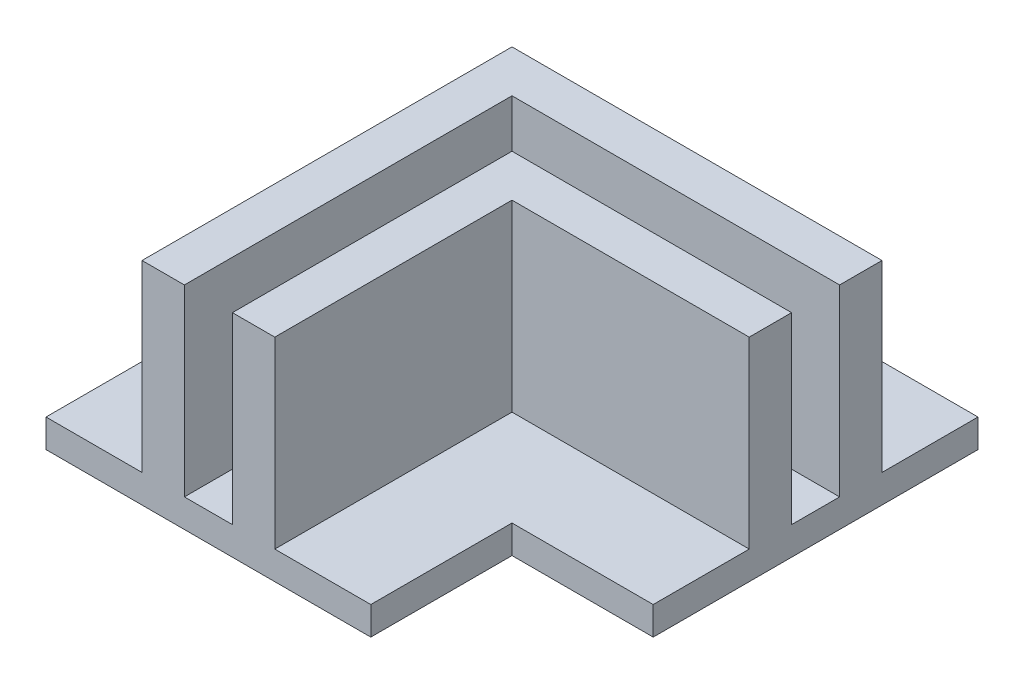
ISO-10303-21;
HEADER;
FILE_DESCRIPTION(('STEP AP214'),'2;1');
FILE_NAME('part.step','',(''),(''),'','','');
FILE_SCHEMA(('AUTOMOTIVE_DESIGN { 1 0 10303 214 1 1 1 1 }'));
ENDSEC;
DATA;
#1=APPLICATION_CONTEXT('core data for automotive mechanical design processes');
#2=APPLICATION_PROTOCOL_DEFINITION('international standard','automotive_design',2000,#1);
#3=PRODUCT_CONTEXT('',#1,'mechanical');
#4=PRODUCT('Part','Part','',(#3));
#5=PRODUCT_RELATED_PRODUCT_CATEGORY('part','',(#4));
#6=PRODUCT_DEFINITION_FORMATION('','',#4);
#7=PRODUCT_DEFINITION_CONTEXT('part definition',#1,'design');
#8=PRODUCT_DEFINITION('design','',#6,#7);
#9=PRODUCT_DEFINITION_SHAPE('','',#8);
#10=(LENGTH_UNIT() NAMED_UNIT(*) SI_UNIT(.MILLI.,.METRE.));
#11=(NAMED_UNIT(*) PLANE_ANGLE_UNIT() SI_UNIT($,.RADIAN.));
#12=(NAMED_UNIT(*) SI_UNIT($,.STERADIAN.) SOLID_ANGLE_UNIT());
#13=UNCERTAINTY_MEASURE_WITH_UNIT(LENGTH_MEASURE(1.E-05),#10,'distance_accuracy_value','');
#14=(GEOMETRIC_REPRESENTATION_CONTEXT(3) GLOBAL_UNCERTAINTY_ASSIGNED_CONTEXT((#13)) GLOBAL_UNIT_ASSIGNED_CONTEXT((#10,
#11,#12)) REPRESENTATION_CONTEXT('',''));
#15=CARTESIAN_POINT('',(0.,0.,0.));
#16=DIRECTION('',(0.,0.,1.));
#17=DIRECTION('',(1.,0.,0.));
#18=AXIS2_PLACEMENT_3D('',#15,#16,#17);
#19=CARTESIAN_POINT('',(0.,15.,0.));
#20=DIRECTION('',(0.,-1.,0.));
#21=DIRECTION('',(0.,0.,-1.));
#22=AXIS2_PLACEMENT_3D('',#19,#20,#21);
#23=PLANE('',#22);
#24=DIRECTION('',(-1.,0.,0.));
#25=VECTOR('',#24,1.);
#26=CARTESIAN_POINT('',(0.,15.,-10.9607142857143));
#27=LINE('',#26,#25);
#28=CARTESIAN_POINT('',(19.6071428571429,15.,-10.9607142857143));
#29=VERTEX_POINT('',#28);
#30=CARTESIAN_POINT('',(-0.192857142857143,15.,-10.9607142857143));
#31=VERTEX_POINT('',#30);
#32=EDGE_CURVE('E162',#29,#31,#27,.T.);
#33=ORIENTED_EDGE('',*,*,#32,.T.);
#34=DIRECTION('',(0.,0.,-1.));
#35=VECTOR('',#34,1.);
#36=CARTESIAN_POINT('',(-0.192857142857143,15.,8.83928571428572));
#37=LINE('',#36,#35);
#38=CARTESIAN_POINT('',(-0.192857142857143,15.,8.83928571428572));
#39=VERTEX_POINT('',#38);
#40=EDGE_CURVE('E165',#39,#31,#37,.T.);
#41=ORIENTED_EDGE('',*,*,#40,.F.);
#42=DIRECTION('',(1.,0.,0.));
#43=VECTOR('',#42,1.);
#44=CARTESIAN_POINT('',(4.60714285714286,15.,8.83928571428572));
#45=LINE('',#44,#43);
#46=CARTESIAN_POINT('',(2.80714285714286,15.,8.83928571428572));
#47=VERTEX_POINT('',#46);
#48=EDGE_CURVE('E216',#39,#47,#45,.T.);
#49=ORIENTED_EDGE('',*,*,#48,.T.);
#50=DIRECTION('',(0.,0.,1.));
#51=VECTOR('',#50,1.);
#52=CARTESIAN_POINT('',(2.80714285714286,15.,-11.1607142857143));
#53=LINE('',#52,#51);
#54=CARTESIAN_POINT('',(2.80714285714286,15.,-7.96071428571428));
#55=VERTEX_POINT('',#54);
#56=EDGE_CURVE('E248',#55,#47,#53,.T.);
#57=ORIENTED_EDGE('',*,*,#56,.F.);
#58=DIRECTION('',(-1.,0.,0.));
#59=VECTOR('',#58,1.);
#60=CARTESIAN_POINT('',(0.,15.,-7.96071428571428));
#61=LINE('',#60,#59);
#62=CARTESIAN_POINT('',(19.6071428571429,15.,-7.96071428571428));
#63=VERTEX_POINT('',#62);
#64=EDGE_CURVE('E173',#63,#55,#61,.T.);
#65=ORIENTED_EDGE('',*,*,#64,.F.);
#66=DIRECTION('',(0.,0.,-1.));
#67=VECTOR('',#66,1.);
#68=CARTESIAN_POINT('',(19.6071428571429,15.,0.));
#69=LINE('',#68,#67);
#70=EDGE_CURVE('E169',#63,#29,#69,.T.);
#71=ORIENTED_EDGE('',*,*,#70,.T.);
#72=EDGE_LOOP('',(#33,#41,#49,#57,#65,#71));
#73=FACE_BOUND('',#72,.T.);
#74=ADVANCED_FACE('F37',(#73),#23,.F.);
#75=CARTESIAN_POINT('',(0.,2.,0.));
#76=DIRECTION('',(0.,1.,0.));
#77=DIRECTION('',(0.,0.,1.));
#78=AXIS2_PLACEMENT_3D('',#75,#76,#77);
#79=PLANE('',#78);
#80=DIRECTION('',(0.,0.,1.));
#81=VECTOR('',#80,1.);
#82=CARTESIAN_POINT('',(-0.192857142857143,2.,-11.1607142857143));
#83=LINE('',#82,#81);
#84=CARTESIAN_POINT('',(-0.192857142857143,2.,-10.9607142857143));
#85=VERTEX_POINT('',#84);
#86=CARTESIAN_POINT('',(-0.192857142857143,2.,8.83928571428572));
#87=VERTEX_POINT('',#86);
#88=EDGE_CURVE('E184',#85,#87,#83,.T.);
#89=ORIENTED_EDGE('',*,*,#88,.F.);
#90=DIRECTION('',(-1.,0.,0.));
#91=VECTOR('',#90,1.);
#92=CARTESIAN_POINT('',(0.,2.,-10.9607142857143));
#93=LINE('',#92,#91);
#94=CARTESIAN_POINT('',(19.6071428571429,2.,-10.9607142857143));
#95=VERTEX_POINT('',#94);
#96=EDGE_CURVE('E178',#95,#85,#93,.T.);
#97=ORIENTED_EDGE('',*,*,#96,.F.);
#98=DIRECTION('',(0.,0.,-1.));
#99=VECTOR('',#98,1.);
#100=CARTESIAN_POINT('',(19.6071428571429,2.,-1.16071428571428));
#101=LINE('',#100,#99);
#102=CARTESIAN_POINT('',(19.6071428571429,2.,-14.3607142857143));
#103=VERTEX_POINT('',#102);
#104=EDGE_CURVE('E279',#95,#103,#101,.T.);
#105=ORIENTED_EDGE('',*,*,#104,.T.);
#106=DIRECTION('',(-1.,0.,0.));
#107=VECTOR('',#106,1.);
#108=CARTESIAN_POINT('',(0.,2.,-14.3607142857143));
#109=LINE('',#108,#107);
#110=CARTESIAN_POINT('',(-3.59285714285714,2.,-14.3607142857143));
#111=VERTEX_POINT('',#110);
#112=EDGE_CURVE('E52',#103,#111,#109,.T.);
#113=ORIENTED_EDGE('',*,*,#112,.T.);
#114=DIRECTION('',(0.,0.,-1.));
#115=VECTOR('',#114,1.);
#116=CARTESIAN_POINT('',(-3.59285714285714,2.,8.83928571428572));
#117=LINE('',#116,#115);
#118=CARTESIAN_POINT('',(-3.59285714285714,2.,8.83928571428572));
#119=VERTEX_POINT('',#118);
#120=EDGE_CURVE('E188',#119,#111,#117,.T.);
#121=ORIENTED_EDGE('',*,*,#120,.F.);
#122=DIRECTION('',(1.,0.,0.));
#123=VECTOR('',#122,1.);
#124=CARTESIAN_POINT('',(0.,2.,8.83928571428572));
#125=LINE('',#124,#123);
#126=EDGE_CURVE('E211',#119,#87,#125,.T.);
#127=ORIENTED_EDGE('',*,*,#126,.T.);
#128=EDGE_LOOP('',(#89,#97,#105,#113,#121,#127));
#129=FACE_BOUND('',#128,.T.);
#130=ADVANCED_FACE('F356',(#129),#79,.T.);
#131=DIRECTION('',(0.,0.,1.));
#132=VECTOR('',#131,1.);
#133=CARTESIAN_POINT('',(-6.59285714285714,2.,-11.1607142857143));
#134=LINE('',#133,#132);
#135=CARTESIAN_POINT('',(-6.59285714285714,2.,-17.3607142857143));
#136=VERTEX_POINT('',#135);
#137=CARTESIAN_POINT('',(-6.59285714285714,2.,8.83928571428572));
#138=VERTEX_POINT('',#137);
#139=EDGE_CURVE('E250',#136,#138,#134,.T.);
#140=ORIENTED_EDGE('',*,*,#139,.F.);
#141=DIRECTION('',(-1.,0.,0.));
#142=VECTOR('',#141,1.);
#143=CARTESIAN_POINT('',(0.,2.,-17.3607142857143));
#144=LINE('',#143,#142);
#145=CARTESIAN_POINT('',(19.6071428571429,2.,-17.3607142857143));
#146=VERTEX_POINT('',#145);
#147=EDGE_CURVE('E304',#146,#136,#144,.T.);
#148=ORIENTED_EDGE('',*,*,#147,.F.);
#149=CARTESIAN_POINT('',(19.6071428571429,2.,-24.1607142857143));
#150=VERTEX_POINT('',#149);
#151=EDGE_CURVE('E280',#146,#150,#101,.T.);
#152=ORIENTED_EDGE('',*,*,#151,.T.);
#153=DIRECTION('',(-1.,0.,0.));
#154=VECTOR('',#153,1.);
#155=CARTESIAN_POINT('',(-13.3928571428571,2.,-24.1607142857143));
#156=LINE('',#155,#154);
#157=CARTESIAN_POINT('',(-13.3928571428571,2.,-24.1607142857143));
#158=VERTEX_POINT('',#157);
#159=EDGE_CURVE('E266',#150,#158,#156,.T.);
#160=ORIENTED_EDGE('',*,*,#159,.T.);
#161=DIRECTION('',(0.,0.,-1.));
#162=VECTOR('',#161,1.);
#163=CARTESIAN_POINT('',(-13.3928571428571,2.,8.83928571428572));
#164=LINE('',#163,#162);
#165=CARTESIAN_POINT('',(-13.3928571428571,2.,8.83928571428572));
#166=VERTEX_POINT('',#165);
#167=EDGE_CURVE('E201',#166,#158,#164,.T.);
#168=ORIENTED_EDGE('',*,*,#167,.F.);
#169=DIRECTION('',(1.,0.,0.));
#170=VECTOR('',#169,1.);
#171=CARTESIAN_POINT('',(0.,2.,8.83928571428572));
#172=LINE('',#171,#170);
#173=EDGE_CURVE('E207',#166,#138,#172,.T.);
#174=ORIENTED_EDGE('',*,*,#173,.T.);
#175=EDGE_LOOP('',(#140,#148,#152,#160,#168,#174));
#176=FACE_BOUND('',#175,.T.);
#177=ADVANCED_FACE('F324',(#176),#79,.T.);
#178=DIRECTION('',(-1.,0.,0.));
#179=VECTOR('',#178,1.);
#180=CARTESIAN_POINT('',(0.,2.,-7.96071428571428));
#181=LINE('',#180,#179);
#182=CARTESIAN_POINT('',(19.6071428571429,2.,-7.96071428571428));
#183=VERTEX_POINT('',#182);
#184=CARTESIAN_POINT('',(2.80714285714286,2.,-7.96071428571428));
#185=VERTEX_POINT('',#184);
#186=EDGE_CURVE('E289',#183,#185,#181,.T.);
#187=ORIENTED_EDGE('',*,*,#186,.T.);
#188=DIRECTION('',(0.,0.,-1.));
#189=VECTOR('',#188,1.);
#190=CARTESIAN_POINT('',(2.80714285714286,2.,8.83928571428572));
#191=LINE('',#190,#189);
#192=CARTESIAN_POINT('',(2.80714285714286,2.,8.83928571428572));
#193=VERTEX_POINT('',#192);
#194=EDGE_CURVE('E240',#193,#185,#191,.T.);
#195=ORIENTED_EDGE('',*,*,#194,.F.);
#196=DIRECTION('',(1.,0.,0.));
#197=VECTOR('',#196,1.);
#198=CARTESIAN_POINT('',(0.,2.,8.83928571428572));
#199=LINE('',#198,#197);
#200=CARTESIAN_POINT('',(9.60714285714286,2.,8.83928571428572));
#201=VERTEX_POINT('',#200);
#202=EDGE_CURVE('E206',#193,#201,#199,.T.);
#203=ORIENTED_EDGE('',*,*,#202,.T.);
#204=DIRECTION('',(0.,0.,1.));
#205=VECTOR('',#204,1.);
#206=CARTESIAN_POINT('',(9.60714285714286,2.,-11.1607142857143));
#207=LINE('',#206,#205);
#208=CARTESIAN_POINT('',(9.60714285714286,2.,-1.16071428571428));
#209=VERTEX_POINT('',#208);
#210=EDGE_CURVE('E186',#209,#201,#207,.T.);
#211=ORIENTED_EDGE('',*,*,#210,.F.);
#212=DIRECTION('',(1.,0.,0.));
#213=VECTOR('',#212,1.);
#214=CARTESIAN_POINT('',(9.60714285714286,2.,-1.16071428571428));
#215=LINE('',#214,#213);
#216=CARTESIAN_POINT('',(19.6071428571429,2.,-1.16071428571428));
#217=VERTEX_POINT('',#216);
#218=EDGE_CURVE('E270',#209,#217,#215,.T.);
#219=ORIENTED_EDGE('',*,*,#218,.T.);
#220=EDGE_CURVE('E277',#217,#183,#101,.T.);
#221=ORIENTED_EDGE('',*,*,#220,.T.);
#222=EDGE_LOOP('',(#187,#195,#203,#211,#219,#221));
#223=FACE_BOUND('',#222,.T.);
#224=ADVANCED_FACE('F347',(#223),#79,.T.);
#225=DIRECTION('',(-1.,0.,0.));
#226=VECTOR('',#225,1.);
#227=CARTESIAN_POINT('',(0.,15.,-14.3607142857143));
#228=LINE('',#227,#226);
#229=CARTESIAN_POINT('',(19.6071428571429,15.,-14.3607142857143));
#230=VERTEX_POINT('',#229);
#231=CARTESIAN_POINT('',(-3.59285714285714,15.,-14.3607142857143));
#232=VERTEX_POINT('',#231);
#233=EDGE_CURVE('E306',#230,#232,#228,.T.);
#234=ORIENTED_EDGE('',*,*,#233,.F.);
#235=DIRECTION('',(0.,0.,-1.));
#236=VECTOR('',#235,1.);
#237=CARTESIAN_POINT('',(19.6071428571429,15.,0.));
#238=LINE('',#237,#236);
#239=CARTESIAN_POINT('',(19.6071428571429,15.,-17.3607142857143));
#240=VERTEX_POINT('',#239);
#241=EDGE_CURVE('E309',#230,#240,#238,.T.);
#242=ORIENTED_EDGE('',*,*,#241,.T.);
#243=DIRECTION('',(-1.,0.,0.));
#244=VECTOR('',#243,1.);
#245=CARTESIAN_POINT('',(0.,15.,-17.3607142857143));
#246=LINE('',#245,#244);
#247=CARTESIAN_POINT('',(-6.59285714285714,15.,-17.3607142857143));
#248=VERTEX_POINT('',#247);
#249=EDGE_CURVE('E303',#240,#248,#246,.T.);
#250=ORIENTED_EDGE('',*,*,#249,.T.);
#251=DIRECTION('',(0.,0.,-1.));
#252=VECTOR('',#251,1.);
#253=CARTESIAN_POINT('',(-6.59285714285714,15.,8.83928571428572));
#254=LINE('',#253,#252);
#255=CARTESIAN_POINT('',(-6.59285714285714,15.,8.83928571428572));
#256=VERTEX_POINT('',#255);
#257=EDGE_CURVE('E230',#256,#248,#254,.T.);
#258=ORIENTED_EDGE('',*,*,#257,.F.);
#259=CARTESIAN_POINT('',(-3.59285714285714,15.,8.83928571428572));
#260=VERTEX_POINT('',#259);
#261=EDGE_CURVE('E218',#256,#260,#45,.T.);
#262=ORIENTED_EDGE('',*,*,#261,.T.);
#263=DIRECTION('',(0.,0.,1.));
#264=VECTOR('',#263,1.);
#265=CARTESIAN_POINT('',(-3.59285714285714,15.,-11.1607142857143));
#266=LINE('',#265,#264);
#267=EDGE_CURVE('E228',#232,#260,#266,.T.);
#268=ORIENTED_EDGE('',*,*,#267,.F.);
#269=EDGE_LOOP('',(#234,#242,#250,#258,#262,#268));
#270=FACE_BOUND('',#269,.T.);
#271=ADVANCED_FACE('F227',(#270),#23,.F.);
#272=CARTESIAN_POINT('',(4.60714285714286,15.,8.83928571428572));
#273=DIRECTION('',(0.,0.,-1.));
#274=DIRECTION('',(-1.,0.,0.));
#275=AXIS2_PLACEMENT_3D('',#272,#273,#274);
#276=PLANE('',#275);
#277=ORIENTED_EDGE('',*,*,#261,.F.);
#278=DIRECTION('',(0.,1.,0.));
#279=VECTOR('',#278,1.);
#280=CARTESIAN_POINT('',(-6.59285714285714,2.,8.83928571428572));
#281=LINE('',#280,#279);
#282=EDGE_CURVE('E235',#138,#256,#281,.T.);
#283=ORIENTED_EDGE('',*,*,#282,.F.);
#284=ORIENTED_EDGE('',*,*,#173,.F.);
#285=DIRECTION('',(0.,1.,0.));
#286=VECTOR('',#285,1.);
#287=CARTESIAN_POINT('',(-13.3928571428571,0.,8.83928571428572));
#288=LINE('',#287,#286);
#289=CARTESIAN_POINT('',(-13.3928571428571,0.,8.83928571428572));
#290=VERTEX_POINT('',#289);
#291=EDGE_CURVE('E198',#290,#166,#288,.T.);
#292=ORIENTED_EDGE('',*,*,#291,.F.);
#293=DIRECTION('',(1.,0.,0.));
#294=VECTOR('',#293,1.);
#295=CARTESIAN_POINT('',(4.60714285714286,0.,8.83928571428572));
#296=LINE('',#295,#294);
#297=CARTESIAN_POINT('',(9.60714285714286,0.,8.83928571428572));
#298=VERTEX_POINT('',#297);
#299=EDGE_CURVE('E210',#290,#298,#296,.T.);
#300=ORIENTED_EDGE('',*,*,#299,.T.);
#301=DIRECTION('',(0.,-1.,0.));
#302=VECTOR('',#301,1.);
#303=CARTESIAN_POINT('',(9.60714285714286,2.,8.83928571428572));
#304=LINE('',#303,#302);
#305=EDGE_CURVE('E193',#201,#298,#304,.T.);
#306=ORIENTED_EDGE('',*,*,#305,.F.);
#307=ORIENTED_EDGE('',*,*,#202,.F.);
#308=DIRECTION('',(0.,-1.,0.));
#309=VECTOR('',#308,1.);
#310=CARTESIAN_POINT('',(2.80714285714286,15.,8.83928571428572));
#311=LINE('',#310,#309);
#312=EDGE_CURVE('E245',#47,#193,#311,.T.);
#313=ORIENTED_EDGE('',*,*,#312,.F.);
#314=ORIENTED_EDGE('',*,*,#48,.F.);
#315=DIRECTION('',(0.,1.,0.));
#316=VECTOR('',#315,1.);
#317=CARTESIAN_POINT('',(-0.192857142857143,2.,8.83928571428572));
#318=LINE('',#317,#316);
#319=EDGE_CURVE('E183',#87,#39,#318,.T.);
#320=ORIENTED_EDGE('',*,*,#319,.F.);
#321=ORIENTED_EDGE('',*,*,#126,.F.);
#322=DIRECTION('',(0.,-1.,0.));
#323=VECTOR('',#322,1.);
#324=CARTESIAN_POINT('',(-3.59285714285714,15.,8.83928571428572));
#325=LINE('',#324,#323);
#326=EDGE_CURVE('E237',#260,#119,#325,.T.);
#327=ORIENTED_EDGE('',*,*,#326,.F.);
#328=EDGE_LOOP('',(#277,#283,#284,#292,#300,#306,#307,#313,#314,#320,#321,#327));
#329=FACE_BOUND('',#328,.T.);
#330=ADVANCED_FACE('F39',(#329),#276,.F.);
#331=CARTESIAN_POINT('',(0.,0.,0.));
#332=DIRECTION('',(0.,-1.,0.));
#333=DIRECTION('',(0.,0.,-1.));
#334=AXIS2_PLACEMENT_3D('',#331,#332,#333);
#335=PLANE('',#334);
#336=DIRECTION('',(0.,0.,1.));
#337=VECTOR('',#336,1.);
#338=CARTESIAN_POINT('',(-13.3928571428571,0.,-11.1607142857143));
#339=LINE('',#338,#337);
#340=CARTESIAN_POINT('',(-13.3928571428571,0.,-24.1607142857143));
#341=VERTEX_POINT('',#340);
#342=EDGE_CURVE('E204',#341,#290,#339,.T.);
#343=ORIENTED_EDGE('',*,*,#342,.F.);
#344=DIRECTION('',(-1.,0.,0.));
#345=VECTOR('',#344,1.);
#346=CARTESIAN_POINT('',(-13.3928571428571,0.,-24.1607142857143));
#347=LINE('',#346,#345);
#348=CARTESIAN_POINT('',(19.6071428571429,0.,-24.1607142857143));
#349=VERTEX_POINT('',#348);
#350=EDGE_CURVE('E267',#349,#341,#347,.T.);
#351=ORIENTED_EDGE('',*,*,#350,.F.);
#352=DIRECTION('',(0.,0.,-1.));
#353=VECTOR('',#352,1.);
#354=CARTESIAN_POINT('',(19.6071428571429,0.,-1.16071428571428));
#355=LINE('',#354,#353);
#356=CARTESIAN_POINT('',(19.6071428571429,0.,-1.16071428571428));
#357=VERTEX_POINT('',#356);
#358=EDGE_CURVE('E271',#357,#349,#355,.T.);
#359=ORIENTED_EDGE('',*,*,#358,.F.);
#360=DIRECTION('',(1.,0.,0.));
#361=VECTOR('',#360,1.);
#362=CARTESIAN_POINT('',(9.60714285714286,0.,-1.16071428571428));
#363=LINE('',#362,#361);
#364=CARTESIAN_POINT('',(9.60714285714286,0.,-1.16071428571428));
#365=VERTEX_POINT('',#364);
#366=EDGE_CURVE('E273',#365,#357,#363,.T.);
#367=ORIENTED_EDGE('',*,*,#366,.F.);
#368=DIRECTION('',(0.,0.,-1.));
#369=VECTOR('',#368,1.);
#370=CARTESIAN_POINT('',(9.60714285714286,0.,8.83928571428572));
#371=LINE('',#370,#369);
#372=EDGE_CURVE('E196',#298,#365,#371,.T.);
#373=ORIENTED_EDGE('',*,*,#372,.F.);
#374=ORIENTED_EDGE('',*,*,#299,.F.);
#375=EDGE_LOOP('',(#343,#351,#359,#367,#373,#374));
#376=FACE_BOUND('',#375,.T.);
#377=ADVANCED_FACE('F335',(#376),#335,.T.);
#378=CARTESIAN_POINT('',(-13.3928571428571,0.,0.));
#379=DIRECTION('',(-1.,0.,0.));
#380=DIRECTION('',(0.,0.,1.));
#381=AXIS2_PLACEMENT_3D('',#378,#379,#380);
#382=PLANE('',#381);
#383=ORIENTED_EDGE('',*,*,#167,.T.);
#384=DIRECTION('',(0.,-1.,0.));
#385=VECTOR('',#384,1.);
#386=CARTESIAN_POINT('',(-13.3928571428571,2.,-24.1607142857143));
#387=LINE('',#386,#385);
#388=EDGE_CURVE('E263',#158,#341,#387,.T.);
#389=ORIENTED_EDGE('',*,*,#388,.T.);
#390=ORIENTED_EDGE('',*,*,#342,.T.);
#391=ORIENTED_EDGE('',*,*,#291,.T.);
#392=EDGE_LOOP('',(#383,#389,#390,#391));
#393=FACE_BOUND('',#392,.T.);
#394=ADVANCED_FACE('F330',(#393),#382,.T.);
#395=CARTESIAN_POINT('',(9.60714285714286,0.,0.));
#396=DIRECTION('',(1.,0.,0.));
#397=DIRECTION('',(0.,0.,-1.));
#398=AXIS2_PLACEMENT_3D('',#395,#396,#397);
#399=PLANE('',#398);
#400=DIRECTION('',(0.,-1.,0.));
#401=VECTOR('',#400,1.);
#402=CARTESIAN_POINT('',(9.60714285714286,2.,-1.16071428571428));
#403=LINE('',#402,#401);
#404=EDGE_CURVE('E254',#209,#365,#403,.T.);
#405=ORIENTED_EDGE('',*,*,#404,.F.);
#406=ORIENTED_EDGE('',*,*,#210,.T.);
#407=ORIENTED_EDGE('',*,*,#305,.T.);
#408=ORIENTED_EDGE('',*,*,#372,.T.);
#409=EDGE_LOOP('',(#405,#406,#407,#408));
#410=FACE_BOUND('',#409,.T.);
#411=ADVANCED_FACE('F340',(#410),#399,.T.);
#412=CARTESIAN_POINT('',(-0.192857142857143,0.,0.));
#413=DIRECTION('',(-1.,0.,0.));
#414=DIRECTION('',(0.,0.,1.));
#415=AXIS2_PLACEMENT_3D('',#412,#413,#414);
#416=PLANE('',#415);
#417=DIRECTION('',(0.,1.,0.));
#418=VECTOR('',#417,1.);
#419=CARTESIAN_POINT('',(-0.192857142857143,0.,-10.9607142857143));
#420=LINE('',#419,#418);
#421=EDGE_CURVE('E11',#85,#31,#420,.T.);
#422=ORIENTED_EDGE('',*,*,#421,.F.);
#423=ORIENTED_EDGE('',*,*,#88,.T.);
#424=ORIENTED_EDGE('',*,*,#319,.T.);
#425=ORIENTED_EDGE('',*,*,#40,.T.);
#426=EDGE_LOOP('',(#422,#423,#424,#425));
#427=FACE_BOUND('',#426,.T.);
#428=ADVANCED_FACE('F181',(#427),#416,.T.);
#429=CARTESIAN_POINT('',(-3.59285714285714,0.,0.));
#430=DIRECTION('',(1.,0.,0.));
#431=DIRECTION('',(0.,0.,-1.));
#432=AXIS2_PLACEMENT_3D('',#429,#430,#431);
#433=PLANE('',#432);
#434=ORIENTED_EDGE('',*,*,#267,.T.);
#435=ORIENTED_EDGE('',*,*,#326,.T.);
#436=ORIENTED_EDGE('',*,*,#120,.T.);
#437=DIRECTION('',(0.,-1.,0.));
#438=VECTOR('',#437,1.);
#439=CARTESIAN_POINT('',(-3.59285714285714,0.,-14.3607142857143));
#440=LINE('',#439,#438);
#441=EDGE_CURVE('E292',#232,#111,#440,.T.);
#442=ORIENTED_EDGE('',*,*,#441,.F.);
#443=EDGE_LOOP('',(#434,#435,#436,#442));
#444=FACE_BOUND('',#443,.T.);
#445=ADVANCED_FACE('F357',(#444),#433,.T.);
#446=CARTESIAN_POINT('',(2.80714285714286,0.,0.));
#447=DIRECTION('',(1.,0.,0.));
#448=DIRECTION('',(0.,0.,-1.));
#449=AXIS2_PLACEMENT_3D('',#446,#447,#448);
#450=PLANE('',#449);
#451=DIRECTION('',(0.,-1.,0.));
#452=VECTOR('',#451,1.);
#453=CARTESIAN_POINT('',(2.80714285714286,0.,-7.96071428571428));
#454=LINE('',#453,#452);
#455=EDGE_CURVE('E275',#55,#185,#454,.T.);
#456=ORIENTED_EDGE('',*,*,#455,.F.);
#457=ORIENTED_EDGE('',*,*,#56,.T.);
#458=ORIENTED_EDGE('',*,*,#312,.T.);
#459=ORIENTED_EDGE('',*,*,#194,.T.);
#460=EDGE_LOOP('',(#456,#457,#458,#459));
#461=FACE_BOUND('',#460,.T.);
#462=ADVANCED_FACE('F351',(#461),#450,.T.);
#463=CARTESIAN_POINT('',(-6.59285714285714,0.,0.));
#464=DIRECTION('',(-1.,0.,0.));
#465=DIRECTION('',(0.,0.,1.));
#466=AXIS2_PLACEMENT_3D('',#463,#464,#465);
#467=PLANE('',#466);
#468=DIRECTION('',(0.,1.,0.));
#469=VECTOR('',#468,1.);
#470=CARTESIAN_POINT('',(-6.59285714285714,0.,-17.3607142857143));
#471=LINE('',#470,#469);
#472=EDGE_CURVE('E45',#136,#248,#471,.T.);
#473=ORIENTED_EDGE('',*,*,#472,.F.);
#474=ORIENTED_EDGE('',*,*,#139,.T.);
#475=ORIENTED_EDGE('',*,*,#282,.T.);
#476=ORIENTED_EDGE('',*,*,#257,.T.);
#477=EDGE_LOOP('',(#473,#474,#475,#476));
#478=FACE_BOUND('',#477,.T.);
#479=ADVANCED_FACE('F323',(#478),#467,.T.);
#480=CARTESIAN_POINT('',(9.60714285714286,2.,-1.16071428571428));
#481=DIRECTION('',(0.,0.,-1.));
#482=DIRECTION('',(-1.,0.,0.));
#483=AXIS2_PLACEMENT_3D('',#480,#481,#482);
#484=PLANE('',#483);
#485=ORIENTED_EDGE('',*,*,#218,.F.);
#486=ORIENTED_EDGE('',*,*,#404,.T.);
#487=ORIENTED_EDGE('',*,*,#366,.T.);
#488=DIRECTION('',(0.,-1.,0.));
#489=VECTOR('',#488,1.);
#490=CARTESIAN_POINT('',(19.6071428571429,2.,-1.16071428571428));
#491=LINE('',#490,#489);
#492=EDGE_CURVE('E257',#217,#357,#491,.T.);
#493=ORIENTED_EDGE('',*,*,#492,.F.);
#494=EDGE_LOOP('',(#485,#486,#487,#493));
#495=FACE_BOUND('',#494,.T.);
#496=ADVANCED_FACE('F343',(#495),#484,.F.);
#497=CARTESIAN_POINT('',(19.6071428571429,2.,-1.16071428571428));
#498=DIRECTION('',(-1.,0.,0.));
#499=DIRECTION('',(0.,0.,1.));
#500=AXIS2_PLACEMENT_3D('',#497,#498,#499);
#501=PLANE('',#500);
#502=ORIENTED_EDGE('',*,*,#358,.T.);
#503=DIRECTION('',(0.,-1.,0.));
#504=VECTOR('',#503,1.);
#505=CARTESIAN_POINT('',(19.6071428571429,2.,-24.1607142857143));
#506=LINE('',#505,#504);
#507=EDGE_CURVE('E260',#150,#349,#506,.T.);
#508=ORIENTED_EDGE('',*,*,#507,.F.);
#509=ORIENTED_EDGE('',*,*,#151,.F.);
#510=DIRECTION('',(0.,-1.,0.));
#511=VECTOR('',#510,1.);
#512=CARTESIAN_POINT('',(19.6071428571429,15.,-17.3607142857143));
#513=LINE('',#512,#511);
#514=EDGE_CURVE('E300',#240,#146,#513,.T.);
#515=ORIENTED_EDGE('',*,*,#514,.F.);
#516=ORIENTED_EDGE('',*,*,#241,.F.);
#517=DIRECTION('',(0.,-1.,0.));
#518=VECTOR('',#517,1.);
#519=CARTESIAN_POINT('',(19.6071428571429,15.,-14.3607142857143));
#520=LINE('',#519,#518);
#521=EDGE_CURVE('E297',#230,#103,#520,.T.);
#522=ORIENTED_EDGE('',*,*,#521,.T.);
#523=ORIENTED_EDGE('',*,*,#104,.F.);
#524=DIRECTION('',(0.,-1.,0.));
#525=VECTOR('',#524,1.);
#526=CARTESIAN_POINT('',(19.6071428571429,15.,-10.9607142857143));
#527=LINE('',#526,#525);
#528=EDGE_CURVE('E284',#29,#95,#527,.T.);
#529=ORIENTED_EDGE('',*,*,#528,.F.);
#530=ORIENTED_EDGE('',*,*,#70,.F.);
#531=DIRECTION('',(0.,-1.,0.));
#532=VECTOR('',#531,1.);
#533=CARTESIAN_POINT('',(19.6071428571429,15.,-7.96071428571428));
#534=LINE('',#533,#532);
#535=EDGE_CURVE('E286',#63,#183,#534,.T.);
#536=ORIENTED_EDGE('',*,*,#535,.T.);
#537=ORIENTED_EDGE('',*,*,#220,.F.);
#538=ORIENTED_EDGE('',*,*,#492,.T.);
#539=EDGE_LOOP('',(#502,#508,#509,#515,#516,#522,#523,#529,#530,#536,#537,#538));
#540=FACE_BOUND('',#539,.T.);
#541=ADVANCED_FACE('F317',(#540),#501,.F.);
#542=CARTESIAN_POINT('',(-13.3928571428571,2.,-24.1607142857143));
#543=DIRECTION('',(0.,0.,1.));
#544=DIRECTION('',(1.,0.,0.));
#545=AXIS2_PLACEMENT_3D('',#542,#543,#544);
#546=PLANE('',#545);
#547=ORIENTED_EDGE('',*,*,#388,.F.);
#548=ORIENTED_EDGE('',*,*,#159,.F.);
#549=ORIENTED_EDGE('',*,*,#507,.T.);
#550=ORIENTED_EDGE('',*,*,#350,.T.);
#551=EDGE_LOOP('',(#547,#548,#549,#550));
#552=FACE_BOUND('',#551,.T.);
#553=ADVANCED_FACE('F423',(#552),#546,.F.);
#554=CARTESIAN_POINT('',(0.,15.,-7.96071428571428));
#555=DIRECTION('',(0.,0.,1.));
#556=DIRECTION('',(1.,0.,0.));
#557=AXIS2_PLACEMENT_3D('',#554,#555,#556);
#558=PLANE('',#557);
#559=ORIENTED_EDGE('',*,*,#64,.T.);
#560=ORIENTED_EDGE('',*,*,#455,.T.);
#561=ORIENTED_EDGE('',*,*,#186,.F.);
#562=ORIENTED_EDGE('',*,*,#535,.F.);
#563=EDGE_LOOP('',(#559,#560,#561,#562));
#564=FACE_BOUND('',#563,.T.);
#565=ADVANCED_FACE('F354',(#564),#558,.T.);
#566=CARTESIAN_POINT('',(0.,15.,-10.9607142857143));
#567=DIRECTION('',(0.,0.,1.));
#568=DIRECTION('',(1.,0.,0.));
#569=AXIS2_PLACEMENT_3D('',#566,#567,#568);
#570=PLANE('',#569);
#571=ORIENTED_EDGE('',*,*,#96,.T.);
#572=ORIENTED_EDGE('',*,*,#421,.T.);
#573=ORIENTED_EDGE('',*,*,#32,.F.);
#574=ORIENTED_EDGE('',*,*,#528,.T.);
#575=EDGE_LOOP('',(#571,#572,#573,#574));
#576=FACE_BOUND('',#575,.T.);
#577=ADVANCED_FACE('F176',(#576),#570,.F.);
#578=CARTESIAN_POINT('',(0.,15.,-14.3607142857143));
#579=DIRECTION('',(0.,0.,1.));
#580=DIRECTION('',(1.,0.,0.));
#581=AXIS2_PLACEMENT_3D('',#578,#579,#580);
#582=PLANE('',#581);
#583=ORIENTED_EDGE('',*,*,#233,.T.);
#584=ORIENTED_EDGE('',*,*,#441,.T.);
#585=ORIENTED_EDGE('',*,*,#112,.F.);
#586=ORIENTED_EDGE('',*,*,#521,.F.);
#587=EDGE_LOOP('',(#583,#584,#585,#586));
#588=FACE_BOUND('',#587,.T.);
#589=ADVANCED_FACE('F312',(#588),#582,.T.);
#590=CARTESIAN_POINT('',(0.,15.,-17.3607142857143));
#591=DIRECTION('',(0.,0.,1.));
#592=DIRECTION('',(1.,0.,0.));
#593=AXIS2_PLACEMENT_3D('',#590,#591,#592);
#594=PLANE('',#593);
#595=ORIENTED_EDGE('',*,*,#249,.F.);
#596=ORIENTED_EDGE('',*,*,#514,.T.);
#597=ORIENTED_EDGE('',*,*,#147,.T.);
#598=ORIENTED_EDGE('',*,*,#472,.T.);
#599=EDGE_LOOP('',(#595,#596,#597,#598));
#600=FACE_BOUND('',#599,.T.);
#601=ADVANCED_FACE('F319',(#600),#594,.F.);
#602=CLOSED_SHELL('',(#74,#130,#177,#224,#271,#330,#377,#394,#411,#428,#445,#462,#479,#496,#541,
#553,#565,#577,#589,#601));
#603=MANIFOLD_SOLID_BREP('B2',#602);
#604=ADVANCED_BREP_SHAPE_REPRESENTATION('',(#18,#603),#14);
#605=SHAPE_DEFINITION_REPRESENTATION(#9,#604);
ENDSEC;
END-ISO-10303-21;
